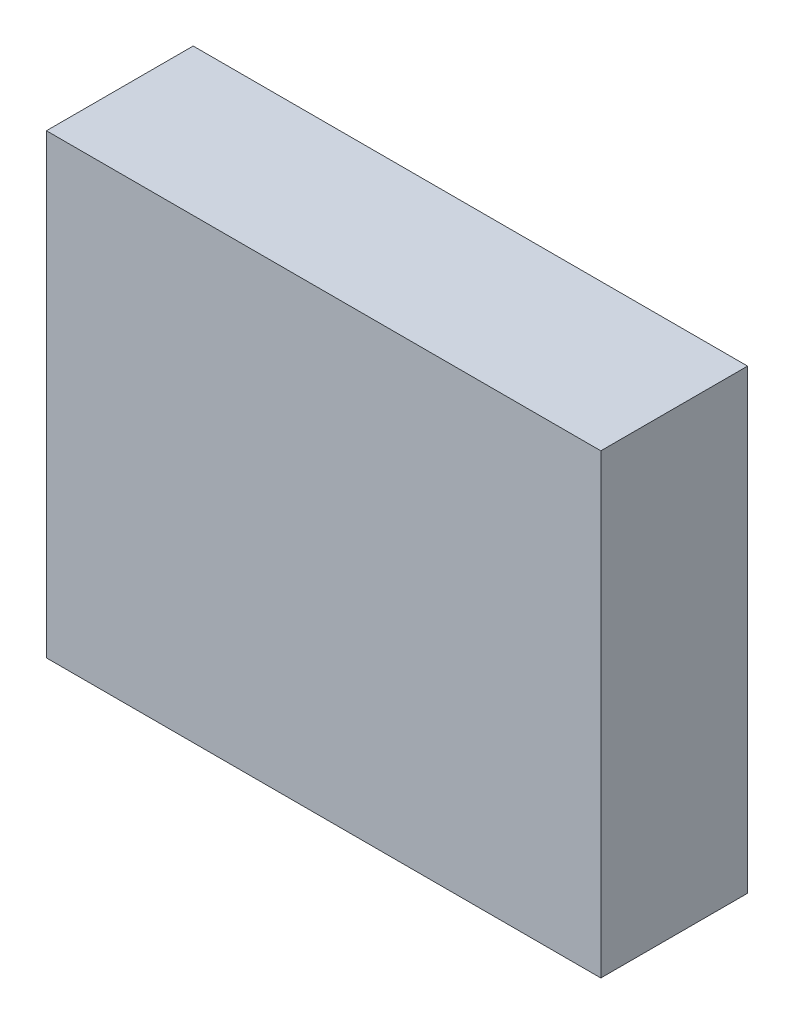
ISO-10303-21;
HEADER;
FILE_DESCRIPTION(('STEP AP214'),'2;1');
FILE_NAME('part.step','',(''),(''),'','','');
FILE_SCHEMA(('AUTOMOTIVE_DESIGN { 1 0 10303 214 1 1 1 1 }'));
ENDSEC;
DATA;
#1=APPLICATION_CONTEXT('core data for automotive mechanical design processes');
#2=APPLICATION_PROTOCOL_DEFINITION('international standard','automotive_design',2000,#1);
#3=PRODUCT_CONTEXT('',#1,'mechanical');
#4=PRODUCT('Part','Part','',(#3));
#5=PRODUCT_RELATED_PRODUCT_CATEGORY('part','',(#4));
#6=PRODUCT_DEFINITION_FORMATION('','',#4);
#7=PRODUCT_DEFINITION_CONTEXT('part definition',#1,'design');
#8=PRODUCT_DEFINITION('design','',#6,#7);
#9=PRODUCT_DEFINITION_SHAPE('','',#8);
#10=(LENGTH_UNIT() NAMED_UNIT(*) SI_UNIT(.MILLI.,.METRE.));
#11=(NAMED_UNIT(*) PLANE_ANGLE_UNIT() SI_UNIT($,.RADIAN.));
#12=(NAMED_UNIT(*) SI_UNIT($,.STERADIAN.) SOLID_ANGLE_UNIT());
#13=UNCERTAINTY_MEASURE_WITH_UNIT(LENGTH_MEASURE(1.E-05),#10,'distance_accuracy_value','');
#14=(GEOMETRIC_REPRESENTATION_CONTEXT(3) GLOBAL_UNCERTAINTY_ASSIGNED_CONTEXT((#13)) GLOBAL_UNIT_ASSIGNED_CONTEXT((#10,
#11,#12)) REPRESENTATION_CONTEXT('',''));
#15=CARTESIAN_POINT('',(0.,0.,0.));
#16=DIRECTION('',(0.,0.,1.));
#17=DIRECTION('',(1.,0.,0.));
#18=AXIS2_PLACEMENT_3D('',#15,#16,#17);
#19=CARTESIAN_POINT('',(107.95,-88.9,57.15));
#20=DIRECTION('',(-1.,0.,0.));
#21=DIRECTION('',(0.,0.,1.));
#22=AXIS2_PLACEMENT_3D('',#19,#20,#21);
#23=PLANE('',#22);
#24=DIRECTION('',(0.,1.,0.));
#25=VECTOR('',#24,1.);
#26=CARTESIAN_POINT('',(107.95,-88.9,0.));
#27=LINE('',#26,#25);
#28=CARTESIAN_POINT('',(107.95,-88.9,0.));
#29=VERTEX_POINT('',#28);
#30=CARTESIAN_POINT('',(107.95,88.9,0.));
#31=VERTEX_POINT('',#30);
#32=EDGE_CURVE('E102',#29,#31,#27,.T.);
#33=ORIENTED_EDGE('',*,*,#32,.T.);
#34=DIRECTION('',(0.,0.,-1.));
#35=VECTOR('',#34,1.);
#36=CARTESIAN_POINT('',(107.95,88.9,57.15));
#37=LINE('',#36,#35);
#38=CARTESIAN_POINT('',(107.95,88.9,57.15));
#39=VERTEX_POINT('',#38);
#40=EDGE_CURVE('E11',#39,#31,#37,.T.);
#41=ORIENTED_EDGE('',*,*,#40,.F.);
#42=DIRECTION('',(0.,1.,0.));
#43=VECTOR('',#42,1.);
#44=CARTESIAN_POINT('',(107.95,-88.9,57.15));
#45=LINE('',#44,#43);
#46=CARTESIAN_POINT('',(107.95,-88.9,57.15));
#47=VERTEX_POINT('',#46);
#48=EDGE_CURVE('E90',#47,#39,#45,.T.);
#49=ORIENTED_EDGE('',*,*,#48,.F.);
#50=DIRECTION('',(0.,0.,-1.));
#51=VECTOR('',#50,1.);
#52=CARTESIAN_POINT('',(107.95,-88.9,57.15));
#53=LINE('',#52,#51);
#54=EDGE_CURVE('E98',#47,#29,#53,.T.);
#55=ORIENTED_EDGE('',*,*,#54,.T.);
#56=EDGE_LOOP('',(#33,#41,#49,#55));
#57=FACE_BOUND('',#56,.T.);
#58=ADVANCED_FACE('F39',(#57),#23,.F.);
#59=CARTESIAN_POINT('',(-107.95,88.9,57.15));
#60=DIRECTION('',(0.,-1.,0.));
#61=DIRECTION('',(0.,0.,-1.));
#62=AXIS2_PLACEMENT_3D('',#59,#60,#61);
#63=PLANE('',#62);
#64=DIRECTION('',(-1.,0.,0.));
#65=VECTOR('',#64,1.);
#66=CARTESIAN_POINT('',(-107.95,88.9,0.));
#67=LINE('',#66,#65);
#68=CARTESIAN_POINT('',(-107.95,88.9,0.));
#69=VERTEX_POINT('',#68);
#70=EDGE_CURVE('E94',#31,#69,#67,.T.);
#71=ORIENTED_EDGE('',*,*,#70,.T.);
#72=DIRECTION('',(0.,0.,-1.));
#73=VECTOR('',#72,1.);
#74=CARTESIAN_POINT('',(-107.95,88.9,57.15));
#75=LINE('',#74,#73);
#76=CARTESIAN_POINT('',(-107.95,88.9,57.15));
#77=VERTEX_POINT('',#76);
#78=EDGE_CURVE('E47',#77,#69,#75,.T.);
#79=ORIENTED_EDGE('',*,*,#78,.F.);
#80=DIRECTION('',(-1.,0.,0.));
#81=VECTOR('',#80,1.);
#82=CARTESIAN_POINT('',(-107.95,88.9,57.15));
#83=LINE('',#82,#81);
#84=EDGE_CURVE('E85',#39,#77,#83,.T.);
#85=ORIENTED_EDGE('',*,*,#84,.F.);
#86=ORIENTED_EDGE('',*,*,#40,.T.);
#87=EDGE_LOOP('',(#71,#79,#85,#86));
#88=FACE_BOUND('',#87,.T.);
#89=ADVANCED_FACE('F93',(#88),#63,.F.);
#90=CARTESIAN_POINT('',(-107.95,-88.9,57.15));
#91=DIRECTION('',(1.,0.,0.));
#92=DIRECTION('',(0.,0.,-1.));
#93=AXIS2_PLACEMENT_3D('',#90,#91,#92);
#94=PLANE('',#93);
#95=DIRECTION('',(0.,-1.,0.));
#96=VECTOR('',#95,1.);
#97=CARTESIAN_POINT('',(-107.95,-88.9,0.));
#98=LINE('',#97,#96);
#99=CARTESIAN_POINT('',(-107.95,-88.9,0.));
#100=VERTEX_POINT('',#99);
#101=EDGE_CURVE('E72',#69,#100,#98,.T.);
#102=ORIENTED_EDGE('',*,*,#101,.T.);
#103=DIRECTION('',(0.,0.,-1.));
#104=VECTOR('',#103,1.);
#105=CARTESIAN_POINT('',(-107.95,-88.9,57.15));
#106=LINE('',#105,#104);
#107=CARTESIAN_POINT('',(-107.95,-88.9,57.15));
#108=VERTEX_POINT('',#107);
#109=EDGE_CURVE('E95',#108,#100,#106,.T.);
#110=ORIENTED_EDGE('',*,*,#109,.F.);
#111=DIRECTION('',(0.,-1.,0.));
#112=VECTOR('',#111,1.);
#113=CARTESIAN_POINT('',(-107.95,-88.9,57.15));
#114=LINE('',#113,#112);
#115=EDGE_CURVE('E88',#77,#108,#114,.T.);
#116=ORIENTED_EDGE('',*,*,#115,.F.);
#117=ORIENTED_EDGE('',*,*,#78,.T.);
#118=EDGE_LOOP('',(#102,#110,#116,#117));
#119=FACE_BOUND('',#118,.T.);
#120=ADVANCED_FACE('F96',(#119),#94,.F.);
#121=CARTESIAN_POINT('',(-107.95,-88.9,57.15));
#122=DIRECTION('',(0.,1.,0.));
#123=DIRECTION('',(0.,0.,1.));
#124=AXIS2_PLACEMENT_3D('',#121,#122,#123);
#125=PLANE('',#124);
#126=DIRECTION('',(1.,0.,0.));
#127=VECTOR('',#126,1.);
#128=CARTESIAN_POINT('',(-107.95,-88.9,0.));
#129=LINE('',#128,#127);
#130=EDGE_CURVE('E78',#100,#29,#129,.T.);
#131=ORIENTED_EDGE('',*,*,#130,.T.);
#132=ORIENTED_EDGE('',*,*,#54,.F.);
#133=DIRECTION('',(1.,0.,0.));
#134=VECTOR('',#133,1.);
#135=CARTESIAN_POINT('',(-107.95,-88.9,57.15));
#136=LINE('',#135,#134);
#137=EDGE_CURVE('E55',#108,#47,#136,.T.);
#138=ORIENTED_EDGE('',*,*,#137,.F.);
#139=ORIENTED_EDGE('',*,*,#109,.T.);
#140=EDGE_LOOP('',(#131,#132,#138,#139));
#141=FACE_BOUND('',#140,.T.);
#142=ADVANCED_FACE('F109',(#141),#125,.F.);
#143=CARTESIAN_POINT('',(0.,0.,57.15));
#144=DIRECTION('',(0.,0.,-1.));
#145=DIRECTION('',(-1.,0.,0.));
#146=AXIS2_PLACEMENT_3D('',#143,#144,#145);
#147=PLANE('',#146);
#148=ORIENTED_EDGE('',*,*,#48,.T.);
#149=ORIENTED_EDGE('',*,*,#84,.T.);
#150=ORIENTED_EDGE('',*,*,#115,.T.);
#151=ORIENTED_EDGE('',*,*,#137,.T.);
#152=EDGE_LOOP('',(#148,#149,#150,#151));
#153=FACE_BOUND('',#152,.T.);
#154=ADVANCED_FACE('F86',(#153),#147,.F.);
#155=CARTESIAN_POINT('',(0.,0.,0.));
#156=DIRECTION('',(0.,0.,-1.));
#157=DIRECTION('',(-1.,0.,0.));
#158=AXIS2_PLACEMENT_3D('',#155,#156,#157);
#159=PLANE('',#158);
#160=ORIENTED_EDGE('',*,*,#32,.F.);
#161=ORIENTED_EDGE('',*,*,#130,.F.);
#162=ORIENTED_EDGE('',*,*,#101,.F.);
#163=ORIENTED_EDGE('',*,*,#70,.F.);
#164=EDGE_LOOP('',(#160,#161,#162,#163));
#165=FACE_BOUND('',#164,.T.);
#166=ADVANCED_FACE('F112',(#165),#159,.T.);
#167=CLOSED_SHELL('',(#58,#89,#120,#142,#154,#166));
#168=MANIFOLD_SOLID_BREP('B2',#167);
#169=ADVANCED_BREP_SHAPE_REPRESENTATION('',(#18,#168),#14);
#170=SHAPE_DEFINITION_REPRESENTATION(#9,#169);
ENDSEC;
END-ISO-10303-21;
